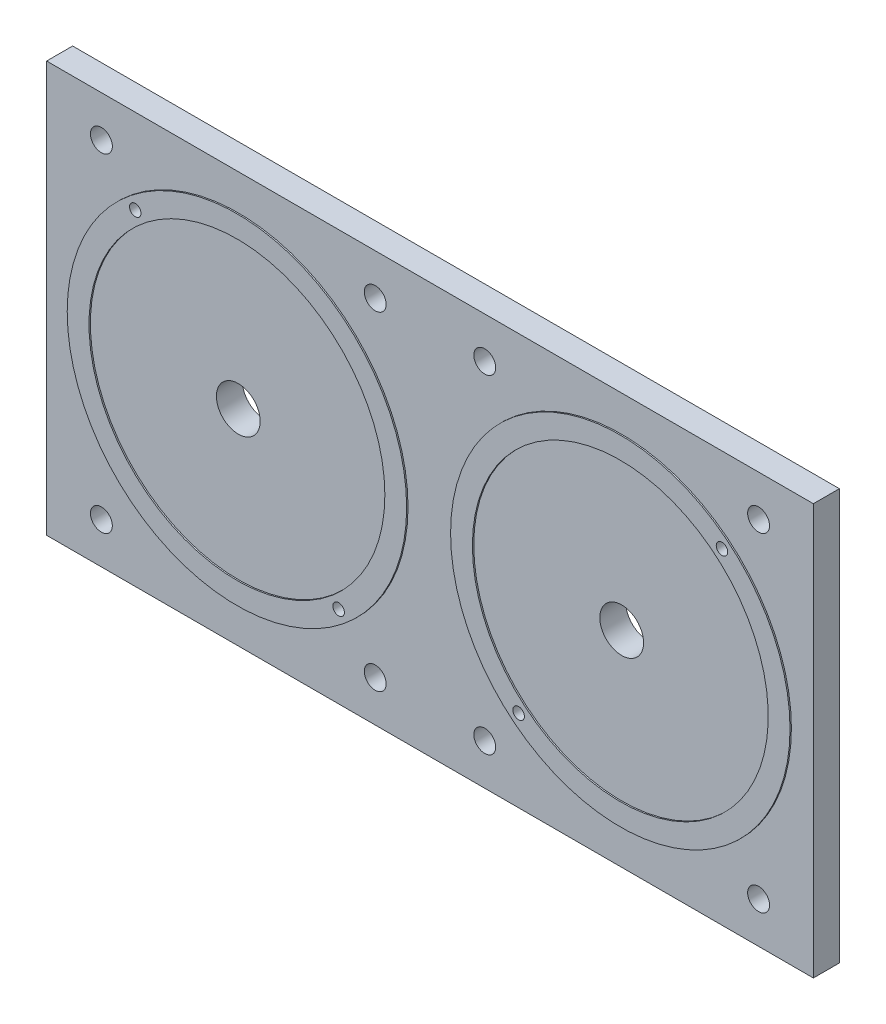
ISO-10303-21;
HEADER;
FILE_DESCRIPTION(('STEP AP214'),'2;1');
FILE_NAME('part.step','',(''),(''),'','','');
FILE_SCHEMA(('AUTOMOTIVE_DESIGN { 1 0 10303 214 1 1 1 1 }'));
ENDSEC;
DATA;
#1=APPLICATION_CONTEXT('core data for automotive mechanical design processes');
#2=APPLICATION_PROTOCOL_DEFINITION('international standard','automotive_design',2000,#1);
#3=PRODUCT_CONTEXT('',#1,'mechanical');
#4=PRODUCT('Part','Part','',(#3));
#5=PRODUCT_RELATED_PRODUCT_CATEGORY('part','',(#4));
#6=PRODUCT_DEFINITION_FORMATION('','',#4);
#7=PRODUCT_DEFINITION_CONTEXT('part definition',#1,'design');
#8=PRODUCT_DEFINITION('design','',#6,#7);
#9=PRODUCT_DEFINITION_SHAPE('','',#8);
#10=(LENGTH_UNIT() NAMED_UNIT(*) SI_UNIT(.MILLI.,.METRE.));
#11=(NAMED_UNIT(*) PLANE_ANGLE_UNIT() SI_UNIT($,.RADIAN.));
#12=(NAMED_UNIT(*) SI_UNIT($,.STERADIAN.) SOLID_ANGLE_UNIT());
#13=UNCERTAINTY_MEASURE_WITH_UNIT(LENGTH_MEASURE(1.E-05),#10,'distance_accuracy_value','');
#14=(GEOMETRIC_REPRESENTATION_CONTEXT(3) GLOBAL_UNCERTAINTY_ASSIGNED_CONTEXT((#13)) GLOBAL_UNIT_ASSIGNED_CONTEXT((#10,
#11,#12)) REPRESENTATION_CONTEXT('',''));
#15=CARTESIAN_POINT('',(0.,0.,0.));
#16=DIRECTION('',(0.,0.,1.));
#17=DIRECTION('',(1.,0.,0.));
#18=AXIS2_PLACEMENT_3D('',#15,#16,#17);
#19=CARTESIAN_POINT('',(0.,0.,4.75));
#20=DIRECTION('',(1.,0.,0.));
#21=DIRECTION('',(0.,0.,-1.));
#22=AXIS2_PLACEMENT_3D('',#19,#20,#21);
#23=PLANE('',#22);
#24=DIRECTION('',(0.,-1.,0.));
#25=VECTOR('',#24,1.);
#26=CARTESIAN_POINT('',(0.,0.,0.));
#27=LINE('',#26,#25);
#28=CARTESIAN_POINT('',(0.,75.,0.));
#29=VERTEX_POINT('',#28);
#30=CARTESIAN_POINT('',(0.,0.,0.));
#31=VERTEX_POINT('',#30);
#32=EDGE_CURVE('E104',#29,#31,#27,.T.);
#33=ORIENTED_EDGE('',*,*,#32,.T.);
#34=DIRECTION('',(0.,0.,-1.));
#35=VECTOR('',#34,1.);
#36=CARTESIAN_POINT('',(0.,0.,4.75));
#37=LINE('',#36,#35);
#38=CARTESIAN_POINT('',(0.,0.,4.75));
#39=VERTEX_POINT('',#38);
#40=EDGE_CURVE('E95',#39,#31,#37,.T.);
#41=ORIENTED_EDGE('',*,*,#40,.F.);
#42=DIRECTION('',(0.,-1.,0.));
#43=VECTOR('',#42,1.);
#44=CARTESIAN_POINT('',(0.,0.,4.75));
#45=LINE('',#44,#43);
#46=CARTESIAN_POINT('',(0.,75.,4.75));
#47=VERTEX_POINT('',#46);
#48=EDGE_CURVE('E89',#47,#39,#45,.T.);
#49=ORIENTED_EDGE('',*,*,#48,.F.);
#50=DIRECTION('',(0.,0.,-1.));
#51=VECTOR('',#50,1.);
#52=CARTESIAN_POINT('',(0.,75.,4.75));
#53=LINE('',#52,#51);
#54=EDGE_CURVE('E100',#47,#29,#53,.T.);
#55=ORIENTED_EDGE('',*,*,#54,.T.);
#56=EDGE_LOOP('',(#33,#41,#49,#55));
#57=FACE_BOUND('',#56,.T.);
#58=ADVANCED_FACE('F35',(#57),#23,.F.);
#59=CARTESIAN_POINT('',(0.,0.,4.75));
#60=DIRECTION('',(0.,1.,0.));
#61=DIRECTION('',(0.,0.,1.));
#62=AXIS2_PLACEMENT_3D('',#59,#60,#61);
#63=PLANE('',#62);
#64=DIRECTION('',(1.,0.,0.));
#65=VECTOR('',#64,1.);
#66=CARTESIAN_POINT('',(0.,0.,0.));
#67=LINE('',#66,#65);
#68=CARTESIAN_POINT('',(140.,0.,0.));
#69=VERTEX_POINT('',#68);
#70=EDGE_CURVE('E94',#31,#69,#67,.T.);
#71=ORIENTED_EDGE('',*,*,#70,.T.);
#72=DIRECTION('',(0.,0.,-1.));
#73=VECTOR('',#72,1.);
#74=CARTESIAN_POINT('',(140.,0.,4.75));
#75=LINE('',#74,#73);
#76=CARTESIAN_POINT('',(140.,0.,4.75));
#77=VERTEX_POINT('',#76);
#78=EDGE_CURVE('E92',#77,#69,#75,.T.);
#79=ORIENTED_EDGE('',*,*,#78,.F.);
#80=DIRECTION('',(1.,0.,0.));
#81=VECTOR('',#80,1.);
#82=CARTESIAN_POINT('',(0.,0.,4.75));
#83=LINE('',#82,#81);
#84=EDGE_CURVE('E84',#39,#77,#83,.T.);
#85=ORIENTED_EDGE('',*,*,#84,.F.);
#86=ORIENTED_EDGE('',*,*,#40,.T.);
#87=EDGE_LOOP('',(#71,#79,#85,#86));
#88=FACE_BOUND('',#87,.T.);
#89=ADVANCED_FACE('F93',(#88),#63,.F.);
#90=CARTESIAN_POINT('',(140.,0.,4.75));
#91=DIRECTION('',(-1.,0.,0.));
#92=DIRECTION('',(0.,0.,1.));
#93=AXIS2_PLACEMENT_3D('',#90,#91,#92);
#94=PLANE('',#93);
#95=DIRECTION('',(0.,1.,0.));
#96=VECTOR('',#95,1.);
#97=CARTESIAN_POINT('',(140.,0.,0.));
#98=LINE('',#97,#96);
#99=CARTESIAN_POINT('',(140.,75.,0.));
#100=VERTEX_POINT('',#99);
#101=EDGE_CURVE('E70',#69,#100,#98,.T.);
#102=ORIENTED_EDGE('',*,*,#101,.T.);
#103=DIRECTION('',(0.,0.,-1.));
#104=VECTOR('',#103,1.);
#105=CARTESIAN_POINT('',(140.,75.,4.75));
#106=LINE('',#105,#104);
#107=CARTESIAN_POINT('',(140.,75.,4.75));
#108=VERTEX_POINT('',#107);
#109=EDGE_CURVE('E96',#108,#100,#106,.T.);
#110=ORIENTED_EDGE('',*,*,#109,.F.);
#111=DIRECTION('',(0.,1.,0.));
#112=VECTOR('',#111,1.);
#113=CARTESIAN_POINT('',(140.,0.,4.75));
#114=LINE('',#113,#112);
#115=EDGE_CURVE('E87',#77,#108,#114,.T.);
#116=ORIENTED_EDGE('',*,*,#115,.F.);
#117=ORIENTED_EDGE('',*,*,#78,.T.);
#118=EDGE_LOOP('',(#102,#110,#116,#117));
#119=FACE_BOUND('',#118,.T.);
#120=ADVANCED_FACE('F98',(#119),#94,.F.);
#121=CARTESIAN_POINT('',(0.,75.,4.75));
#122=DIRECTION('',(0.,-1.,0.));
#123=DIRECTION('',(0.,0.,-1.));
#124=AXIS2_PLACEMENT_3D('',#121,#122,#123);
#125=PLANE('',#124);
#126=DIRECTION('',(-1.,0.,0.));
#127=VECTOR('',#126,1.);
#128=CARTESIAN_POINT('',(0.,75.,0.));
#129=LINE('',#128,#127);
#130=EDGE_CURVE('E76',#100,#29,#129,.T.);
#131=ORIENTED_EDGE('',*,*,#130,.T.);
#132=ORIENTED_EDGE('',*,*,#54,.F.);
#133=DIRECTION('',(-1.,0.,0.));
#134=VECTOR('',#133,1.);
#135=CARTESIAN_POINT('',(0.,75.,4.75));
#136=LINE('',#135,#134);
#137=EDGE_CURVE('E53',#108,#47,#136,.T.);
#138=ORIENTED_EDGE('',*,*,#137,.F.);
#139=ORIENTED_EDGE('',*,*,#109,.T.);
#140=EDGE_LOOP('',(#131,#132,#138,#139));
#141=FACE_BOUND('',#140,.T.);
#142=ADVANCED_FACE('F202',(#141),#125,.F.);
#143=CARTESIAN_POINT('',(0.,0.,4.75));
#144=DIRECTION('',(0.,0.,-1.));
#145=DIRECTION('',(-1.,0.,0.));
#146=AXIS2_PLACEMENT_3D('',#143,#144,#145);
#147=PLANE('',#146);
#148=CARTESIAN_POINT('',(130.,67.5,4.75));
#149=DIRECTION('',(0.,0.,-1.));
#150=DIRECTION('',(-1.,0.,0.));
#151=AXIS2_PLACEMENT_3D('',#148,#149,#150);
#152=CIRCLE('',#151,2.);
#153=CARTESIAN_POINT('',(128.,67.5,4.75));
#154=VERTEX_POINT('',#153);
#155=EDGE_CURVE('E163',#154,#154,#152,.T.);
#156=ORIENTED_EDGE('',*,*,#155,.T.);
#157=EDGE_LOOP('',(#156));
#158=FACE_BOUND('',#157,.T.);
#159=CARTESIAN_POINT('',(80.,67.5,4.75));
#160=DIRECTION('',(0.,0.,-1.));
#161=DIRECTION('',(-1.,0.,0.));
#162=AXIS2_PLACEMENT_3D('',#159,#160,#161);
#163=CIRCLE('',#162,2.);
#164=CARTESIAN_POINT('',(78.,67.5,4.75));
#165=VERTEX_POINT('',#164);
#166=EDGE_CURVE('E160',#165,#165,#163,.T.);
#167=ORIENTED_EDGE('',*,*,#166,.T.);
#168=EDGE_LOOP('',(#167));
#169=FACE_BOUND('',#168,.T.);
#170=CARTESIAN_POINT('',(80.,7.50000000000001,4.75));
#171=DIRECTION('',(0.,0.,-1.));
#172=DIRECTION('',(-1.,0.,0.));
#173=AXIS2_PLACEMENT_3D('',#170,#171,#172);
#174=CIRCLE('',#173,2.);
#175=CARTESIAN_POINT('',(78.,7.50000000000001,4.75));
#176=VERTEX_POINT('',#175);
#177=EDGE_CURVE('E157',#176,#176,#174,.T.);
#178=ORIENTED_EDGE('',*,*,#177,.T.);
#179=EDGE_LOOP('',(#178));
#180=FACE_BOUND('',#179,.T.);
#181=CARTESIAN_POINT('',(130.,7.50000000000002,4.75));
#182=DIRECTION('',(0.,0.,-1.));
#183=DIRECTION('',(-1.,0.,0.));
#184=AXIS2_PLACEMENT_3D('',#181,#182,#183);
#185=CIRCLE('',#184,2.);
#186=CARTESIAN_POINT('',(128.,7.50000000000002,4.75));
#187=VERTEX_POINT('',#186);
#188=EDGE_CURVE('E154',#187,#187,#185,.T.);
#189=ORIENTED_EDGE('',*,*,#188,.T.);
#190=EDGE_LOOP('',(#189));
#191=FACE_BOUND('',#190,.T.);
#192=CARTESIAN_POINT('',(10.,7.50000000000002,4.75));
#193=DIRECTION('',(0.,0.,-1.));
#194=DIRECTION('',(-1.,0.,0.));
#195=AXIS2_PLACEMENT_3D('',#192,#193,#194);
#196=CIRCLE('',#195,2.);
#197=CARTESIAN_POINT('',(8.00000000000001,7.50000000000002,4.75));
#198=VERTEX_POINT('',#197);
#199=EDGE_CURVE('E151',#198,#198,#196,.T.);
#200=ORIENTED_EDGE('',*,*,#199,.T.);
#201=EDGE_LOOP('',(#200));
#202=FACE_BOUND('',#201,.T.);
#203=CARTESIAN_POINT('',(60.,7.50000000000001,4.75));
#204=DIRECTION('',(0.,0.,-1.));
#205=DIRECTION('',(-1.,0.,0.));
#206=AXIS2_PLACEMENT_3D('',#203,#204,#205);
#207=CIRCLE('',#206,2.);
#208=CARTESIAN_POINT('',(58.,7.50000000000001,4.75));
#209=VERTEX_POINT('',#208);
#210=EDGE_CURVE('E148',#209,#209,#207,.T.);
#211=ORIENTED_EDGE('',*,*,#210,.T.);
#212=EDGE_LOOP('',(#211));
#213=FACE_BOUND('',#212,.T.);
#214=CARTESIAN_POINT('',(60.,67.5,4.75));
#215=DIRECTION('',(0.,0.,-1.));
#216=DIRECTION('',(-1.,0.,0.));
#217=AXIS2_PLACEMENT_3D('',#214,#215,#216);
#218=CIRCLE('',#217,2.);
#219=CARTESIAN_POINT('',(58.,67.5,4.75));
#220=VERTEX_POINT('',#219);
#221=EDGE_CURVE('E121',#220,#220,#218,.T.);
#222=ORIENTED_EDGE('',*,*,#221,.T.);
#223=EDGE_LOOP('',(#222));
#224=FACE_BOUND('',#223,.T.);
#225=CARTESIAN_POINT('',(10.,67.5,4.75));
#226=DIRECTION('',(0.,0.,-1.));
#227=DIRECTION('',(-1.,0.,0.));
#228=AXIS2_PLACEMENT_3D('',#225,#226,#227);
#229=CIRCLE('',#228,2.);
#230=CARTESIAN_POINT('',(8.00000000000001,67.5,4.75));
#231=VERTEX_POINT('',#230);
#232=EDGE_CURVE('E169',#231,#231,#229,.T.);
#233=ORIENTED_EDGE('',*,*,#232,.T.);
#234=EDGE_LOOP('',(#233));
#235=FACE_BOUND('',#234,.T.);
#236=CARTESIAN_POINT('',(105.,37.5,4.75));
#237=DIRECTION('',(0.,0.,-1.));
#238=DIRECTION('',(-1.,0.,0.));
#239=AXIS2_PLACEMENT_3D('',#236,#237,#238);
#240=CIRCLE('',#239,30.99);
#241=CARTESIAN_POINT('',(74.01,37.5,4.75));
#242=VERTEX_POINT('',#241);
#243=EDGE_CURVE('E11',#242,#242,#240,.F.);
#244=ORIENTED_EDGE('',*,*,#243,.F.);
#245=EDGE_LOOP('',(#244));
#246=FACE_BOUND('',#245,.T.);
#247=CARTESIAN_POINT('',(35.,37.5,4.75));
#248=DIRECTION('',(0.,0.,-1.));
#249=DIRECTION('',(-1.,0.,0.));
#250=AXIS2_PLACEMENT_3D('',#247,#248,#249);
#251=CIRCLE('',#250,30.99);
#252=CARTESIAN_POINT('',(4.01000000000002,37.5,4.75));
#253=VERTEX_POINT('',#252);
#254=EDGE_CURVE('E44',#253,#253,#251,.F.);
#255=ORIENTED_EDGE('',*,*,#254,.F.);
#256=EDGE_LOOP('',(#255));
#257=FACE_BOUND('',#256,.T.);
#258=ORIENTED_EDGE('',*,*,#48,.T.);
#259=ORIENTED_EDGE('',*,*,#84,.T.);
#260=ORIENTED_EDGE('',*,*,#115,.T.);
#261=ORIENTED_EDGE('',*,*,#137,.T.);
#262=EDGE_LOOP('',(#258,#259,#260,#261));
#263=FACE_BOUND('',#262,.T.);
#264=ADVANCED_FACE('F85',(#158,#169,#180,#191,#202,#213,#224,#235,#246,#257,#263),#147,.F.);
#265=CARTESIAN_POINT('',(0.,0.,0.));
#266=DIRECTION('',(0.,0.,-1.));
#267=DIRECTION('',(-1.,0.,0.));
#268=AXIS2_PLACEMENT_3D('',#265,#266,#267);
#269=PLANE('',#268);
#270=CARTESIAN_POINT('',(130.,67.5,0.));
#271=DIRECTION('',(0.,0.,1.));
#272=DIRECTION('',(-1.,0.,0.));
#273=AXIS2_PLACEMENT_3D('',#270,#271,#272);
#274=CIRCLE('',#273,2.);
#275=CARTESIAN_POINT('',(128.,67.5,0.));
#276=VERTEX_POINT('',#275);
#277=EDGE_CURVE('E145',#276,#276,#274,.T.);
#278=ORIENTED_EDGE('',*,*,#277,.T.);
#279=EDGE_LOOP('',(#278));
#280=FACE_BOUND('',#279,.T.);
#281=CARTESIAN_POINT('',(35.,37.5,0.));
#282=DIRECTION('',(0.,0.,1.));
#283=DIRECTION('',(1.,0.,0.));
#284=AXIS2_PLACEMENT_3D('',#281,#282,#283);
#285=CIRCLE('',#284,4.00000000000001);
#286=CARTESIAN_POINT('',(39.,37.5,0.));
#287=VERTEX_POINT('',#286);
#288=EDGE_CURVE('E459',#287,#287,#285,.T.);
#289=ORIENTED_EDGE('',*,*,#288,.T.);
#290=EDGE_LOOP('',(#289));
#291=FACE_BOUND('',#290,.T.);
#292=CARTESIAN_POINT('',(105.,37.5,0.));
#293=DIRECTION('',(0.,0.,1.));
#294=DIRECTION('',(1.,0.,0.));
#295=AXIS2_PLACEMENT_3D('',#292,#293,#294);
#296=CIRCLE('',#295,4.00000000000001);
#297=CARTESIAN_POINT('',(109.,37.5,0.));
#298=VERTEX_POINT('',#297);
#299=EDGE_CURVE('E131',#298,#298,#296,.T.);
#300=ORIENTED_EDGE('',*,*,#299,.T.);
#301=EDGE_LOOP('',(#300));
#302=FACE_BOUND('',#301,.T.);
#303=CARTESIAN_POINT('',(16.4346524097301,59.7784171083239,0.));
#304=DIRECTION('',(0.,0.,1.));
#305=DIRECTION('',(1.,0.,0.));
#306=AXIS2_PLACEMENT_3D('',#303,#304,#305);
#307=CIRCLE('',#306,1.05);
#308=CARTESIAN_POINT('',(17.4846524097301,59.7784171083239,0.));
#309=VERTEX_POINT('',#308);
#310=EDGE_CURVE('E482',#309,#309,#307,.T.);
#311=ORIENTED_EDGE('',*,*,#310,.T.);
#312=EDGE_LOOP('',(#311));
#313=FACE_BOUND('',#312,.T.);
#314=CARTESIAN_POINT('',(53.5653475902699,15.2215828916761,0.));
#315=DIRECTION('',(0.,0.,1.));
#316=DIRECTION('',(-1.,0.,0.));
#317=AXIS2_PLACEMENT_3D('',#314,#315,#316);
#318=CIRCLE('',#317,1.05);
#319=CARTESIAN_POINT('',(52.5153475902699,15.2215828916761,0.));
#320=VERTEX_POINT('',#319);
#321=EDGE_CURVE('E476',#320,#320,#318,.T.);
#322=ORIENTED_EDGE('',*,*,#321,.T.);
#323=EDGE_LOOP('',(#322));
#324=FACE_BOUND('',#323,.T.);
#325=CARTESIAN_POINT('',(123.56534759027,59.7784171083239,0.));
#326=DIRECTION('',(0.,0.,1.));
#327=DIRECTION('',(-1.,0.,0.));
#328=AXIS2_PLACEMENT_3D('',#325,#326,#327);
#329=CIRCLE('',#328,1.04999999999999);
#330=CARTESIAN_POINT('',(122.51534759027,59.7784171083239,0.));
#331=VERTEX_POINT('',#330);
#332=EDGE_CURVE('E470',#331,#331,#329,.T.);
#333=ORIENTED_EDGE('',*,*,#332,.T.);
#334=EDGE_LOOP('',(#333));
#335=FACE_BOUND('',#334,.T.);
#336=CARTESIAN_POINT('',(86.4346524097301,15.2215828916761,0.));
#337=DIRECTION('',(0.,0.,1.));
#338=DIRECTION('',(1.,0.,0.));
#339=AXIS2_PLACEMENT_3D('',#336,#337,#338);
#340=CIRCLE('',#339,1.04999999999999);
#341=CARTESIAN_POINT('',(87.4846524097301,15.2215828916761,0.));
#342=VERTEX_POINT('',#341);
#343=EDGE_CURVE('E463',#342,#342,#340,.T.);
#344=ORIENTED_EDGE('',*,*,#343,.T.);
#345=EDGE_LOOP('',(#344));
#346=FACE_BOUND('',#345,.T.);
#347=CARTESIAN_POINT('',(80.,67.5,0.));
#348=DIRECTION('',(0.,0.,1.));
#349=DIRECTION('',(-1.,0.,0.));
#350=AXIS2_PLACEMENT_3D('',#347,#348,#349);
#351=CIRCLE('',#350,2.);
#352=CARTESIAN_POINT('',(78.,67.5,0.));
#353=VERTEX_POINT('',#352);
#354=EDGE_CURVE('E142',#353,#353,#351,.T.);
#355=ORIENTED_EDGE('',*,*,#354,.T.);
#356=EDGE_LOOP('',(#355));
#357=FACE_BOUND('',#356,.T.);
#358=CARTESIAN_POINT('',(80.,7.50000000000001,0.));
#359=DIRECTION('',(0.,0.,1.));
#360=DIRECTION('',(1.,0.,0.));
#361=AXIS2_PLACEMENT_3D('',#358,#359,#360);
#362=CIRCLE('',#361,2.);
#363=CARTESIAN_POINT('',(82.,7.50000000000001,0.));
#364=VERTEX_POINT('',#363);
#365=EDGE_CURVE('E139',#364,#364,#362,.T.);
#366=ORIENTED_EDGE('',*,*,#365,.T.);
#367=EDGE_LOOP('',(#366));
#368=FACE_BOUND('',#367,.T.);
#369=CARTESIAN_POINT('',(130.,7.50000000000002,0.));
#370=DIRECTION('',(0.,0.,1.));
#371=DIRECTION('',(1.,0.,0.));
#372=AXIS2_PLACEMENT_3D('',#369,#370,#371);
#373=CIRCLE('',#372,2.);
#374=CARTESIAN_POINT('',(132.,7.50000000000002,0.));
#375=VERTEX_POINT('',#374);
#376=EDGE_CURVE('E136',#375,#375,#373,.T.);
#377=ORIENTED_EDGE('',*,*,#376,.T.);
#378=EDGE_LOOP('',(#377));
#379=FACE_BOUND('',#378,.T.);
#380=CARTESIAN_POINT('',(10.,7.50000000000002,0.));
#381=DIRECTION('',(0.,0.,1.));
#382=DIRECTION('',(-1.,0.,0.));
#383=AXIS2_PLACEMENT_3D('',#380,#381,#382);
#384=CIRCLE('',#383,2.);
#385=CARTESIAN_POINT('',(8.00000000000001,7.50000000000002,0.));
#386=VERTEX_POINT('',#385);
#387=EDGE_CURVE('E128',#386,#386,#384,.T.);
#388=ORIENTED_EDGE('',*,*,#387,.T.);
#389=EDGE_LOOP('',(#388));
#390=FACE_BOUND('',#389,.T.);
#391=CARTESIAN_POINT('',(60.,7.50000000000001,0.));
#392=DIRECTION('',(0.,0.,1.));
#393=DIRECTION('',(-1.,0.,0.));
#394=AXIS2_PLACEMENT_3D('',#391,#392,#393);
#395=CIRCLE('',#394,2.);
#396=CARTESIAN_POINT('',(58.,7.50000000000001,0.));
#397=VERTEX_POINT('',#396);
#398=EDGE_CURVE('E123',#397,#397,#395,.T.);
#399=ORIENTED_EDGE('',*,*,#398,.T.);
#400=EDGE_LOOP('',(#399));
#401=FACE_BOUND('',#400,.T.);
#402=CARTESIAN_POINT('',(60.,67.5,0.));
#403=DIRECTION('',(0.,0.,1.));
#404=DIRECTION('',(1.,0.,0.));
#405=AXIS2_PLACEMENT_3D('',#402,#403,#404);
#406=CIRCLE('',#405,2.);
#407=CARTESIAN_POINT('',(62.,67.5,0.));
#408=VERTEX_POINT('',#407);
#409=EDGE_CURVE('E117',#408,#408,#406,.T.);
#410=ORIENTED_EDGE('',*,*,#409,.T.);
#411=EDGE_LOOP('',(#410));
#412=FACE_BOUND('',#411,.T.);
#413=CARTESIAN_POINT('',(10.,67.5,0.));
#414=DIRECTION('',(0.,0.,1.));
#415=DIRECTION('',(1.,0.,0.));
#416=AXIS2_PLACEMENT_3D('',#413,#414,#415);
#417=CIRCLE('',#416,2.);
#418=CARTESIAN_POINT('',(12.,67.5,0.));
#419=VERTEX_POINT('',#418);
#420=EDGE_CURVE('E166',#419,#419,#417,.T.);
#421=ORIENTED_EDGE('',*,*,#420,.T.);
#422=EDGE_LOOP('',(#421));
#423=FACE_BOUND('',#422,.T.);
#424=ORIENTED_EDGE('',*,*,#32,.F.);
#425=ORIENTED_EDGE('',*,*,#130,.F.);
#426=ORIENTED_EDGE('',*,*,#101,.F.);
#427=ORIENTED_EDGE('',*,*,#70,.F.);
#428=EDGE_LOOP('',(#424,#425,#426,#427));
#429=FACE_BOUND('',#428,.T.);
#430=ADVANCED_FACE('F201',(#280,#291,#302,#313,#324,#335,#346,#357,#368,#379,#390,#401,#412,
#423,#429),#269,.T.);
#431=CARTESIAN_POINT('',(35.,37.5,5.));
#432=DIRECTION('',(0.,0.,1.));
#433=DIRECTION('',(1.,0.,0.));
#434=AXIS2_PLACEMENT_3D('',#431,#432,#433);
#435=PLANE('',#434);
#436=CARTESIAN_POINT('',(16.4346524097301,59.7784171083239,5.));
#437=DIRECTION('',(0.,0.,1.));
#438=DIRECTION('',(1.,0.,0.));
#439=AXIS2_PLACEMENT_3D('',#436,#437,#438);
#440=CIRCLE('',#439,1.05);
#441=CARTESIAN_POINT('',(17.4846524097301,59.7784171083239,5.));
#442=VERTEX_POINT('',#441);
#443=EDGE_CURVE('E479',#442,#442,#440,.T.);
#444=ORIENTED_EDGE('',*,*,#443,.F.);
#445=EDGE_LOOP('',(#444));
#446=FACE_BOUND('',#445,.T.);
#447=CARTESIAN_POINT('',(53.5653475902699,15.2215828916761,5.));
#448=DIRECTION('',(0.,0.,1.));
#449=DIRECTION('',(-1.,0.,0.));
#450=AXIS2_PLACEMENT_3D('',#447,#448,#449);
#451=CIRCLE('',#450,1.05);
#452=CARTESIAN_POINT('',(52.5153475902699,15.2215828916761,5.));
#453=VERTEX_POINT('',#452);
#454=EDGE_CURVE('E473',#453,#453,#451,.T.);
#455=ORIENTED_EDGE('',*,*,#454,.F.);
#456=EDGE_LOOP('',(#455));
#457=FACE_BOUND('',#456,.T.);
#458=CARTESIAN_POINT('',(35.,37.5,5.));
#459=DIRECTION('',(0.,0.,1.));
#460=DIRECTION('',(1.,0.,0.));
#461=AXIS2_PLACEMENT_3D('',#458,#459,#460);
#462=CIRCLE('',#461,30.99);
#463=CARTESIAN_POINT('',(65.99,37.5,5.));
#464=VERTEX_POINT('',#463);
#465=EDGE_CURVE('E107',#464,#464,#462,.T.);
#466=ORIENTED_EDGE('',*,*,#465,.T.);
#467=EDGE_LOOP('',(#466));
#468=FACE_BOUND('',#467,.T.);
#469=CARTESIAN_POINT('',(35.,37.5,5.));
#470=DIRECTION('',(0.,0.,1.));
#471=DIRECTION('',(1.,0.,0.));
#472=AXIS2_PLACEMENT_3D('',#469,#470,#471);
#473=CIRCLE('',#472,27.01);
#474=CARTESIAN_POINT('',(62.01,37.5,5.));
#475=VERTEX_POINT('',#474);
#476=EDGE_CURVE('E182',#475,#475,#473,.T.);
#477=ORIENTED_EDGE('',*,*,#476,.F.);
#478=EDGE_LOOP('',(#477));
#479=FACE_BOUND('',#478,.T.);
#480=ADVANCED_FACE('F190',(#446,#457,#468,#479),#435,.T.);
#481=CARTESIAN_POINT('',(35.,37.5,5.));
#482=DIRECTION('',(0.,0.,-1.));
#483=DIRECTION('',(-1.,0.,0.));
#484=AXIS2_PLACEMENT_3D('',#481,#482,#483);
#485=CYLINDRICAL_SURFACE('',#484,30.99);
#486=ORIENTED_EDGE('',*,*,#465,.F.);
#487=EDGE_LOOP('',(#486));
#488=FACE_BOUND('',#487,.T.);
#489=ORIENTED_EDGE('',*,*,#254,.T.);
#490=EDGE_LOOP('',(#489));
#491=FACE_BOUND('',#490,.T.);
#492=ADVANCED_FACE('F193',(#488,#491),#485,.T.);
#493=CARTESIAN_POINT('',(35.,37.5,5.));
#494=DIRECTION('',(0.,0.,-1.));
#495=DIRECTION('',(-1.,0.,0.));
#496=AXIS2_PLACEMENT_3D('',#493,#494,#495);
#497=CYLINDRICAL_SURFACE('',#496,27.01);
#498=ORIENTED_EDGE('',*,*,#476,.T.);
#499=EDGE_LOOP('',(#498));
#500=FACE_BOUND('',#499,.T.);
#501=CARTESIAN_POINT('',(35.,37.5,4.75));
#502=DIRECTION('',(0.,0.,1.));
#503=DIRECTION('',(1.,0.,0.));
#504=AXIS2_PLACEMENT_3D('',#501,#502,#503);
#505=CIRCLE('',#504,27.01);
#506=CARTESIAN_POINT('',(62.01,37.5,4.75));
#507=VERTEX_POINT('',#506);
#508=EDGE_CURVE('E181',#507,#507,#505,.T.);
#509=ORIENTED_EDGE('',*,*,#508,.F.);
#510=EDGE_LOOP('',(#509));
#511=FACE_BOUND('',#510,.T.);
#512=ADVANCED_FACE('F196',(#500,#511),#497,.F.);
#513=CARTESIAN_POINT('',(35.,37.5,4.75));
#514=DIRECTION('',(0.,0.,-1.));
#515=DIRECTION('',(-1.,0.,0.));
#516=AXIS2_PLACEMENT_3D('',#513,#514,#515);
#517=CIRCLE('',#516,4.00000000000001);
#518=CARTESIAN_POINT('',(31.,37.5,4.75));
#519=VERTEX_POINT('',#518);
#520=EDGE_CURVE('E38',#519,#519,#517,.T.);
#521=ORIENTED_EDGE('',*,*,#520,.T.);
#522=EDGE_LOOP('',(#521));
#523=FACE_BOUND('',#522,.T.);
#524=ORIENTED_EDGE('',*,*,#508,.T.);
#525=EDGE_LOOP('',(#524));
#526=FACE_BOUND('',#525,.T.);
#527=ADVANCED_FACE('F206',(#523,#526),#147,.F.);
#528=CARTESIAN_POINT('',(105.,37.5,5.));
#529=DIRECTION('',(0.,0.,-1.));
#530=DIRECTION('',(-1.,0.,0.));
#531=AXIS2_PLACEMENT_3D('',#528,#529,#530);
#532=PLANE('',#531);
#533=CARTESIAN_POINT('',(123.56534759027,59.7784171083239,5.));
#534=DIRECTION('',(0.,0.,1.));
#535=DIRECTION('',(-1.,0.,0.));
#536=AXIS2_PLACEMENT_3D('',#533,#534,#535);
#537=CIRCLE('',#536,1.04999999999999);
#538=CARTESIAN_POINT('',(122.51534759027,59.7784171083239,5.));
#539=VERTEX_POINT('',#538);
#540=EDGE_CURVE('E466',#539,#539,#537,.T.);
#541=ORIENTED_EDGE('',*,*,#540,.F.);
#542=EDGE_LOOP('',(#541));
#543=FACE_BOUND('',#542,.T.);
#544=CARTESIAN_POINT('',(86.4346524097301,15.2215828916761,5.));
#545=DIRECTION('',(0.,0.,1.));
#546=DIRECTION('',(1.,0.,0.));
#547=AXIS2_PLACEMENT_3D('',#544,#545,#546);
#548=CIRCLE('',#547,1.04999999999999);
#549=CARTESIAN_POINT('',(87.4846524097301,15.2215828916761,5.));
#550=VERTEX_POINT('',#549);
#551=EDGE_CURVE('E467',#550,#550,#548,.T.);
#552=ORIENTED_EDGE('',*,*,#551,.F.);
#553=EDGE_LOOP('',(#552));
#554=FACE_BOUND('',#553,.T.);
#555=CARTESIAN_POINT('',(105.,37.5,5.));
#556=DIRECTION('',(0.,0.,1.));
#557=DIRECTION('',(-1.,0.,0.));
#558=AXIS2_PLACEMENT_3D('',#555,#556,#557);
#559=CIRCLE('',#558,30.99);
#560=CARTESIAN_POINT('',(74.01,37.5,5.));
#561=VERTEX_POINT('',#560);
#562=EDGE_CURVE('E176',#561,#561,#559,.T.);
#563=ORIENTED_EDGE('',*,*,#562,.T.);
#564=EDGE_LOOP('',(#563));
#565=FACE_BOUND('',#564,.T.);
#566=CARTESIAN_POINT('',(105.,37.5,5.));
#567=DIRECTION('',(0.,0.,1.));
#568=DIRECTION('',(-1.,0.,0.));
#569=AXIS2_PLACEMENT_3D('',#566,#567,#568);
#570=CIRCLE('',#569,27.01);
#571=CARTESIAN_POINT('',(77.99,37.5,5.));
#572=VERTEX_POINT('',#571);
#573=EDGE_CURVE('E173',#572,#572,#570,.T.);
#574=ORIENTED_EDGE('',*,*,#573,.F.);
#575=EDGE_LOOP('',(#574));
#576=FACE_BOUND('',#575,.T.);
#577=ADVANCED_FACE('F219',(#543,#554,#565,#576),#532,.F.);
#578=CARTESIAN_POINT('',(105.,37.5,5.));
#579=DIRECTION('',(0.,0.,-1.));
#580=DIRECTION('',(-1.,0.,0.));
#581=AXIS2_PLACEMENT_3D('',#578,#579,#580);
#582=CYLINDRICAL_SURFACE('',#581,30.99);
#583=ORIENTED_EDGE('',*,*,#562,.F.);
#584=EDGE_LOOP('',(#583));
#585=FACE_BOUND('',#584,.T.);
#586=ORIENTED_EDGE('',*,*,#243,.T.);
#587=EDGE_LOOP('',(#586));
#588=FACE_BOUND('',#587,.T.);
#589=ADVANCED_FACE('F262',(#585,#588),#582,.T.);
#590=CARTESIAN_POINT('',(105.,37.5,5.));
#591=DIRECTION('',(0.,0.,-1.));
#592=DIRECTION('',(-1.,0.,0.));
#593=AXIS2_PLACEMENT_3D('',#590,#591,#592);
#594=CYLINDRICAL_SURFACE('',#593,27.01);
#595=ORIENTED_EDGE('',*,*,#573,.T.);
#596=EDGE_LOOP('',(#595));
#597=FACE_BOUND('',#596,.T.);
#598=CARTESIAN_POINT('',(105.,37.5,4.75));
#599=DIRECTION('',(0.,0.,1.));
#600=DIRECTION('',(-1.,0.,0.));
#601=AXIS2_PLACEMENT_3D('',#598,#599,#600);
#602=CIRCLE('',#601,27.01);
#603=CARTESIAN_POINT('',(77.99,37.5,4.75));
#604=VERTEX_POINT('',#603);
#605=EDGE_CURVE('E172',#604,#604,#602,.T.);
#606=ORIENTED_EDGE('',*,*,#605,.F.);
#607=EDGE_LOOP('',(#606));
#608=FACE_BOUND('',#607,.T.);
#609=ADVANCED_FACE('F217',(#597,#608),#594,.F.);
#610=CARTESIAN_POINT('',(105.,37.5,4.75));
#611=DIRECTION('',(0.,0.,-1.));
#612=DIRECTION('',(-1.,0.,0.));
#613=AXIS2_PLACEMENT_3D('',#610,#611,#612);
#614=CIRCLE('',#613,4.00000000000001);
#615=CARTESIAN_POINT('',(101.,37.5,4.75));
#616=VERTEX_POINT('',#615);
#617=EDGE_CURVE('E115',#616,#616,#614,.T.);
#618=ORIENTED_EDGE('',*,*,#617,.T.);
#619=EDGE_LOOP('',(#618));
#620=FACE_BOUND('',#619,.T.);
#621=ORIENTED_EDGE('',*,*,#605,.T.);
#622=EDGE_LOOP('',(#621));
#623=FACE_BOUND('',#622,.T.);
#624=ADVANCED_FACE('F205',(#620,#623),#147,.F.);
#625=CARTESIAN_POINT('',(10.,67.5,0.));
#626=DIRECTION('',(0.,0.,1.));
#627=DIRECTION('',(1.,0.,0.));
#628=AXIS2_PLACEMENT_3D('',#625,#626,#627);
#629=CYLINDRICAL_SURFACE('',#628,2.);
#630=ORIENTED_EDGE('',*,*,#420,.F.);
#631=EDGE_LOOP('',(#630));
#632=FACE_BOUND('',#631,.T.);
#633=ORIENTED_EDGE('',*,*,#232,.F.);
#634=EDGE_LOOP('',(#633));
#635=FACE_BOUND('',#634,.T.);
#636=ADVANCED_FACE('F216',(#632,#635),#629,.F.);
#637=CARTESIAN_POINT('',(105.,37.5,0.));
#638=DIRECTION('',(0.,0.,1.));
#639=DIRECTION('',(1.,0.,0.));
#640=AXIS2_PLACEMENT_3D('',#637,#638,#639);
#641=CYLINDRICAL_SURFACE('',#640,4.00000000000001);
#642=ORIENTED_EDGE('',*,*,#299,.F.);
#643=EDGE_LOOP('',(#642));
#644=FACE_BOUND('',#643,.T.);
#645=ORIENTED_EDGE('',*,*,#617,.F.);
#646=EDGE_LOOP('',(#645));
#647=FACE_BOUND('',#646,.T.);
#648=ADVANCED_FACE('F321',(#644,#647),#641,.F.);
#649=CARTESIAN_POINT('',(86.4346524097301,15.2215828916761,0.));
#650=DIRECTION('',(0.,0.,1.));
#651=DIRECTION('',(1.,0.,0.));
#652=AXIS2_PLACEMENT_3D('',#649,#650,#651);
#653=CYLINDRICAL_SURFACE('',#652,1.04999999999999);
#654=ORIENTED_EDGE('',*,*,#343,.F.);
#655=EDGE_LOOP('',(#654));
#656=FACE_BOUND('',#655,.T.);
#657=ORIENTED_EDGE('',*,*,#551,.T.);
#658=EDGE_LOOP('',(#657));
#659=FACE_BOUND('',#658,.T.);
#660=ADVANCED_FACE('F331',(#656,#659),#653,.F.);
#661=CARTESIAN_POINT('',(123.56534759027,59.7784171083239,0.));
#662=DIRECTION('',(0.,0.,1.));
#663=DIRECTION('',(1.,0.,0.));
#664=AXIS2_PLACEMENT_3D('',#661,#662,#663);
#665=CYLINDRICAL_SURFACE('',#664,1.04999999999999);
#666=ORIENTED_EDGE('',*,*,#332,.F.);
#667=EDGE_LOOP('',(#666));
#668=FACE_BOUND('',#667,.T.);
#669=ORIENTED_EDGE('',*,*,#540,.T.);
#670=EDGE_LOOP('',(#669));
#671=FACE_BOUND('',#670,.T.);
#672=ADVANCED_FACE('F341',(#668,#671),#665,.F.);
#673=CARTESIAN_POINT('',(35.,37.5,0.));
#674=DIRECTION('',(0.,0.,1.));
#675=DIRECTION('',(1.,0.,0.));
#676=AXIS2_PLACEMENT_3D('',#673,#674,#675);
#677=CYLINDRICAL_SURFACE('',#676,4.00000000000001);
#678=ORIENTED_EDGE('',*,*,#288,.F.);
#679=EDGE_LOOP('',(#678));
#680=FACE_BOUND('',#679,.T.);
#681=ORIENTED_EDGE('',*,*,#520,.F.);
#682=EDGE_LOOP('',(#681));
#683=FACE_BOUND('',#682,.T.);
#684=ADVANCED_FACE('F351',(#680,#683),#677,.F.);
#685=CARTESIAN_POINT('',(53.5653475902699,15.2215828916761,0.));
#686=DIRECTION('',(0.,0.,1.));
#687=DIRECTION('',(1.,0.,0.));
#688=AXIS2_PLACEMENT_3D('',#685,#686,#687);
#689=CYLINDRICAL_SURFACE('',#688,1.05);
#690=ORIENTED_EDGE('',*,*,#321,.F.);
#691=EDGE_LOOP('',(#690));
#692=FACE_BOUND('',#691,.T.);
#693=ORIENTED_EDGE('',*,*,#454,.T.);
#694=EDGE_LOOP('',(#693));
#695=FACE_BOUND('',#694,.T.);
#696=ADVANCED_FACE('F361',(#692,#695),#689,.F.);
#697=CARTESIAN_POINT('',(16.4346524097301,59.7784171083239,0.));
#698=DIRECTION('',(0.,0.,1.));
#699=DIRECTION('',(1.,0.,0.));
#700=AXIS2_PLACEMENT_3D('',#697,#698,#699);
#701=CYLINDRICAL_SURFACE('',#700,1.05);
#702=ORIENTED_EDGE('',*,*,#310,.F.);
#703=EDGE_LOOP('',(#702));
#704=FACE_BOUND('',#703,.T.);
#705=ORIENTED_EDGE('',*,*,#443,.T.);
#706=EDGE_LOOP('',(#705));
#707=FACE_BOUND('',#706,.T.);
#708=ADVANCED_FACE('F371',(#704,#707),#701,.F.);
#709=CARTESIAN_POINT('',(60.,67.5,0.));
#710=DIRECTION('',(0.,0.,1.));
#711=DIRECTION('',(1.,0.,0.));
#712=AXIS2_PLACEMENT_3D('',#709,#710,#711);
#713=CYLINDRICAL_SURFACE('',#712,2.);
#714=ORIENTED_EDGE('',*,*,#409,.F.);
#715=EDGE_LOOP('',(#714));
#716=FACE_BOUND('',#715,.T.);
#717=ORIENTED_EDGE('',*,*,#221,.F.);
#718=EDGE_LOOP('',(#717));
#719=FACE_BOUND('',#718,.T.);
#720=ADVANCED_FACE('F381',(#716,#719),#713,.F.);
#721=CARTESIAN_POINT('',(60.,7.50000000000001,0.));
#722=DIRECTION('',(0.,0.,1.));
#723=DIRECTION('',(1.,0.,0.));
#724=AXIS2_PLACEMENT_3D('',#721,#722,#723);
#725=CYLINDRICAL_SURFACE('',#724,2.);
#726=ORIENTED_EDGE('',*,*,#398,.F.);
#727=EDGE_LOOP('',(#726));
#728=FACE_BOUND('',#727,.T.);
#729=ORIENTED_EDGE('',*,*,#210,.F.);
#730=EDGE_LOOP('',(#729));
#731=FACE_BOUND('',#730,.T.);
#732=ADVANCED_FACE('F391',(#728,#731),#725,.F.);
#733=CARTESIAN_POINT('',(10.,7.50000000000002,0.));
#734=DIRECTION('',(0.,0.,1.));
#735=DIRECTION('',(1.,0.,0.));
#736=AXIS2_PLACEMENT_3D('',#733,#734,#735);
#737=CYLINDRICAL_SURFACE('',#736,2.);
#738=ORIENTED_EDGE('',*,*,#387,.F.);
#739=EDGE_LOOP('',(#738));
#740=FACE_BOUND('',#739,.T.);
#741=ORIENTED_EDGE('',*,*,#199,.F.);
#742=EDGE_LOOP('',(#741));
#743=FACE_BOUND('',#742,.T.);
#744=ADVANCED_FACE('F401',(#740,#743),#737,.F.);
#745=CARTESIAN_POINT('',(130.,7.50000000000002,0.));
#746=DIRECTION('',(0.,0.,1.));
#747=DIRECTION('',(1.,0.,0.));
#748=AXIS2_PLACEMENT_3D('',#745,#746,#747);
#749=CYLINDRICAL_SURFACE('',#748,2.);
#750=ORIENTED_EDGE('',*,*,#376,.F.);
#751=EDGE_LOOP('',(#750));
#752=FACE_BOUND('',#751,.T.);
#753=ORIENTED_EDGE('',*,*,#188,.F.);
#754=EDGE_LOOP('',(#753));
#755=FACE_BOUND('',#754,.T.);
#756=ADVANCED_FACE('F411',(#752,#755),#749,.F.);
#757=CARTESIAN_POINT('',(80.,7.50000000000001,0.));
#758=DIRECTION('',(0.,0.,1.));
#759=DIRECTION('',(1.,0.,0.));
#760=AXIS2_PLACEMENT_3D('',#757,#758,#759);
#761=CYLINDRICAL_SURFACE('',#760,2.);
#762=ORIENTED_EDGE('',*,*,#365,.F.);
#763=EDGE_LOOP('',(#762));
#764=FACE_BOUND('',#763,.T.);
#765=ORIENTED_EDGE('',*,*,#177,.F.);
#766=EDGE_LOOP('',(#765));
#767=FACE_BOUND('',#766,.T.);
#768=ADVANCED_FACE('F421',(#764,#767),#761,.F.);
#769=CARTESIAN_POINT('',(80.,67.5,0.));
#770=DIRECTION('',(0.,0.,1.));
#771=DIRECTION('',(1.,0.,0.));
#772=AXIS2_PLACEMENT_3D('',#769,#770,#771);
#773=CYLINDRICAL_SURFACE('',#772,2.);
#774=ORIENTED_EDGE('',*,*,#354,.F.);
#775=EDGE_LOOP('',(#774));
#776=FACE_BOUND('',#775,.T.);
#777=ORIENTED_EDGE('',*,*,#166,.F.);
#778=EDGE_LOOP('',(#777));
#779=FACE_BOUND('',#778,.T.);
#780=ADVANCED_FACE('F431',(#776,#779),#773,.F.);
#781=CARTESIAN_POINT('',(130.,67.5,0.));
#782=DIRECTION('',(0.,0.,1.));
#783=DIRECTION('',(1.,0.,0.));
#784=AXIS2_PLACEMENT_3D('',#781,#782,#783);
#785=CYLINDRICAL_SURFACE('',#784,2.);
#786=ORIENTED_EDGE('',*,*,#277,.F.);
#787=EDGE_LOOP('',(#786));
#788=FACE_BOUND('',#787,.T.);
#789=ORIENTED_EDGE('',*,*,#155,.F.);
#790=EDGE_LOOP('',(#789));
#791=FACE_BOUND('',#790,.T.);
#792=ADVANCED_FACE('F441',(#788,#791),#785,.F.);
#793=CLOSED_SHELL('',(#58,#89,#120,#142,#264,#430,#480,#492,#512,#527,#577,#589,#609,#624,#636,
#648,#660,#672,#684,#696,#708,#720,#732,#744,#756,#768,#780,#792));
#794=MANIFOLD_SOLID_BREP('B2',#793);
#795=ADVANCED_BREP_SHAPE_REPRESENTATION('',(#18,#794),#14);
#796=SHAPE_DEFINITION_REPRESENTATION(#9,#795);
ENDSEC;
END-ISO-10303-21;
